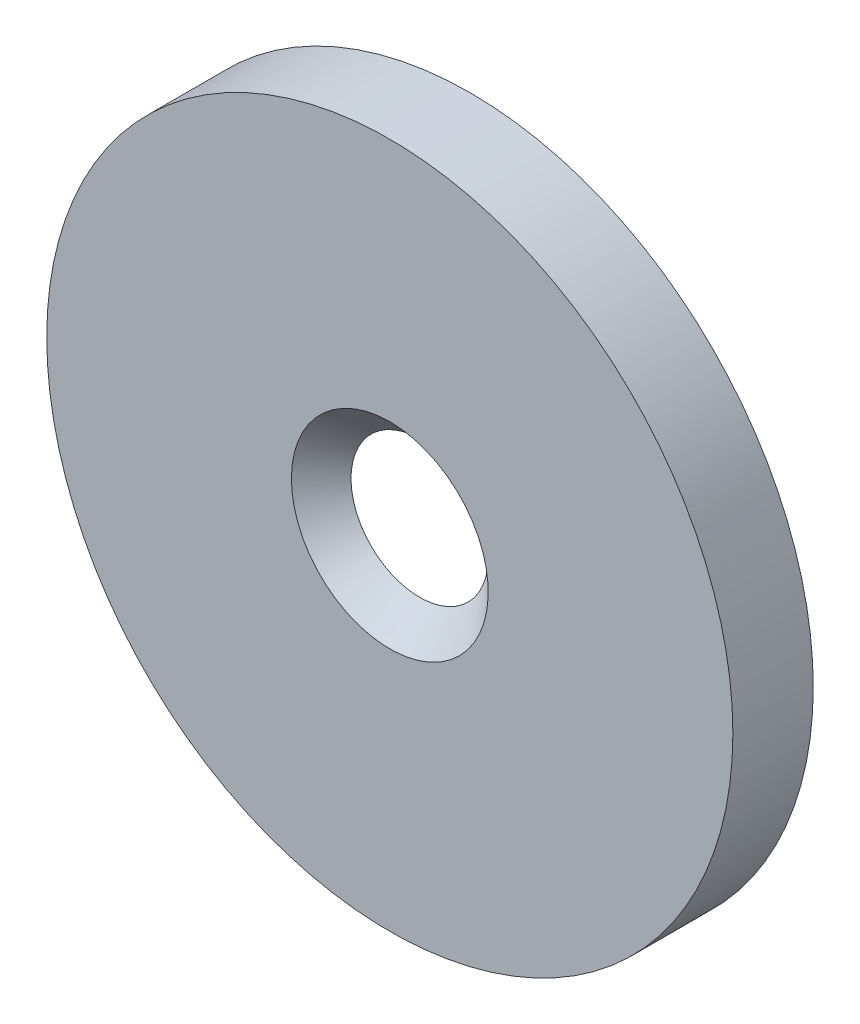
ISO-10303-21;
HEADER;
FILE_DESCRIPTION(('STEP AP214'),'2;1');
FILE_NAME('part.step','',(''),(''),'','','');
FILE_SCHEMA(('AUTOMOTIVE_DESIGN { 1 0 10303 214 1 1 1 1 }'));
ENDSEC;
DATA;
#1=APPLICATION_CONTEXT('core data for automotive mechanical design processes');
#2=APPLICATION_PROTOCOL_DEFINITION('international standard','automotive_design',2000,#1);
#3=PRODUCT_CONTEXT('',#1,'mechanical');
#4=PRODUCT('Part','Part','',(#3));
#5=PRODUCT_RELATED_PRODUCT_CATEGORY('part','',(#4));
#6=PRODUCT_DEFINITION_FORMATION('','',#4);
#7=PRODUCT_DEFINITION_CONTEXT('part definition',#1,'design');
#8=PRODUCT_DEFINITION('design','',#6,#7);
#9=PRODUCT_DEFINITION_SHAPE('','',#8);
#10=(LENGTH_UNIT() NAMED_UNIT(*) SI_UNIT(.MILLI.,.METRE.));
#11=(NAMED_UNIT(*) PLANE_ANGLE_UNIT() SI_UNIT($,.RADIAN.));
#12=(NAMED_UNIT(*) SI_UNIT($,.STERADIAN.) SOLID_ANGLE_UNIT());
#13=UNCERTAINTY_MEASURE_WITH_UNIT(LENGTH_MEASURE(1.E-05),#10,'distance_accuracy_value','');
#14=(GEOMETRIC_REPRESENTATION_CONTEXT(3) GLOBAL_UNCERTAINTY_ASSIGNED_CONTEXT((#13)) GLOBAL_UNIT_ASSIGNED_CONTEXT((#10,
#11,#12)) REPRESENTATION_CONTEXT('',''));
#15=CARTESIAN_POINT('',(0.,0.,0.));
#16=DIRECTION('',(0.,0.,1.));
#17=DIRECTION('',(1.,0.,0.));
#18=AXIS2_PLACEMENT_3D('',#15,#16,#17);
#19=CARTESIAN_POINT('',(0.,0.,-0.00199999999999853));
#20=DIRECTION('',(0.,0.,1.));
#21=DIRECTION('',(1.,0.,0.));
#22=AXIS2_PLACEMENT_3D('',#19,#20,#21);
#23=CYLINDRICAL_SURFACE('',#22,15.);
#24=CARTESIAN_POINT('',(0.,0.,20.0733));
#25=DIRECTION('',(0.,0.,1.));
#26=DIRECTION('',(1.,0.,0.));
#27=AXIS2_PLACEMENT_3D('',#24,#25,#26);
#28=CIRCLE('',#27,15.);
#29=CARTESIAN_POINT('',(15.,0.,20.0733));
#30=VERTEX_POINT('',#29);
#31=EDGE_CURVE('E10',#30,#30,#28,.T.);
#32=ORIENTED_EDGE('',*,*,#31,.F.);
#33=EDGE_LOOP('',(#32));
#34=FACE_BOUND('',#33,.T.);
#35=CARTESIAN_POINT('',(0.,0.,16.5588898069488));
#36=DIRECTION('',(0.,0.,1.));
#37=DIRECTION('',(1.,0.,0.));
#38=AXIS2_PLACEMENT_3D('',#35,#36,#37);
#39=CIRCLE('',#38,15.);
#40=CARTESIAN_POINT('',(0.,15.,16.5588898069488));
#41=VERTEX_POINT('',#40);
#42=EDGE_CURVE('E41',#41,#41,#39,.T.);
#43=ORIENTED_EDGE('',*,*,#42,.T.);
#44=EDGE_LOOP('',(#43));
#45=FACE_BOUND('',#44,.T.);
#46=ADVANCED_FACE('F35',(#34,#45),#23,.T.);
#47=CARTESIAN_POINT('',(0.,0.,20.0733));
#48=DIRECTION('',(0.,0.,1.));
#49=DIRECTION('',(1.,0.,0.));
#50=AXIS2_PLACEMENT_3D('',#47,#48,#49);
#51=PLANE('',#50);
#52=CARTESIAN_POINT('',(0.,0.,20.0733));
#53=DIRECTION('',(0.,0.,-1.));
#54=DIRECTION('',(-1.,0.,0.));
#55=AXIS2_PLACEMENT_3D('',#52,#53,#54);
#56=CIRCLE('',#55,4.30330900900983);
#57=CARTESIAN_POINT('',(-4.30330900900983,0.,20.0733));
#58=VERTEX_POINT('',#57);
#59=EDGE_CURVE('E53',#58,#58,#56,.T.);
#60=ORIENTED_EDGE('',*,*,#59,.T.);
#61=EDGE_LOOP('',(#60));
#62=FACE_BOUND('',#61,.T.);
#63=ORIENTED_EDGE('',*,*,#31,.T.);
#64=EDGE_LOOP('',(#63));
#65=FACE_BOUND('',#64,.T.);
#66=ADVANCED_FACE('F59',(#62,#65),#51,.T.);
#67=CARTESIAN_POINT('',(0.,0.,-31.18));
#68=DIRECTION('',(0.,0.,1.));
#69=DIRECTION('',(0.,1.,0.));
#70=AXIS2_PLACEMENT_3D('',#67,#68,#69);
#71=SPHERICAL_SURFACE('',#70,50.04);
#72=CARTESIAN_POINT('',(0.,0.,18.7699909909902));
#73=DIRECTION('',(0.,0.,-1.));
#74=DIRECTION('',(-1.,0.,0.));
#75=AXIS2_PLACEMENT_3D('',#72,#73,#74);
#76=CIRCLE('',#75,3.);
#77=CARTESIAN_POINT('',(0.,2.99999999999988,18.7699909909902));
#78=VERTEX_POINT('',#77);
#79=EDGE_CURVE('E46',#78,#78,#76,.T.);
#80=CARTESIAN_POINT('',(0.,2.99999999999988,18.7699909909902));
#81=CARTESIAN_POINT('',(0.,3.12719206790899,18.7623518365923));
#82=CARTESIAN_POINT('',(0.,3.2543549560647,18.7542268416389));
#83=CARTESIAN_POINT('',(0.,3.50861495510901,18.7370056894649));
#84=CARTESIAN_POINT('',(0.,3.63571206599762,18.7279095322442));
#85=CARTESIAN_POINT('',(0.,3.88983309274744,18.7087465743794));
#86=CARTESIAN_POINT('',(0.,4.01685700860866,18.6986797737353));
#87=CARTESIAN_POINT('',(0.,4.27082423284337,18.6775761196964));
#88=CARTESIAN_POINT('',(0.,4.39776754121686,18.6665392663017));
#89=CARTESIAN_POINT('',(0.,4.65156614244413,18.6434961499745));
#90=CARTESIAN_POINT('',(0.,4.77842143529792,18.6314898870421));
#91=CARTESIAN_POINT('',(0.,5.03203660266396,18.6065086525139));
#92=CARTESIAN_POINT('',(0.,5.15879647717621,18.5935336809182));
#93=CARTESIAN_POINT('',(0.,5.41221341058583,18.5666157861764));
#94=CARTESIAN_POINT('',(0.,5.53887046948321,18.5526728630303));
#95=CARTESIAN_POINT('',(0.,5.79207438039501,18.5238198788651));
#96=CARTESIAN_POINT('',(0.,5.91862123240943,18.5089098178461));
#97=CARTESIAN_POINT('',(0.,6.17159734471714,18.4781234280305));
#98=CARTESIAN_POINT('',(0.,6.29802660501042,18.4622470992338));
#99=CARTESIAN_POINT('',(0.,6.55076015590026,18.4295291003519));
#100=CARTESIAN_POINT('',(0.,6.67706444649682,18.4126874302666));
#101=CARTESIAN_POINT('',(0.,6.92954068731034,18.3780397316289));
#102=CARTESIAN_POINT('',(0.,7.0557126375273,18.3602337030765));
#103=CARTESIAN_POINT('',(0.,7.30791683462172,18.323658326603));
#104=CARTESIAN_POINT('',(0.,7.43394908149917,18.3048889786819));
#105=CARTESIAN_POINT('',(0.,7.68586651710724,18.2663880587855));
#106=CARTESIAN_POINT('',(0.,7.81175170583786,18.2466564868102));
#107=CARTESIAN_POINT('',(0.,8.06336767892676,18.2062322702718));
#108=CARTESIAN_POINT('',(0.,8.18909846328504,18.1855396257088));
#109=CARTESIAN_POINT('',(0.,8.44039829041425,18.1431944715463));
#110=CARTESIAN_POINT('',(0.,8.56596733318518,18.1215419619468));
#111=CARTESIAN_POINT('',(0.,8.81693634936337,18.0772783412774));
#112=CARTESIAN_POINT('',(0.,8.94233632277063,18.0546672302074));
#113=CARTESIAN_POINT('',(0.,9.19295988231146,18.0084877261033));
#114=CARTESIAN_POINT('',(0.,9.31818346844503,17.9849193330692));
#115=CARTESIAN_POINT('',(0.,9.56844694582181,17.936826640407));
#116=CARTESIAN_POINT('',(0.,9.69348683706502,17.9123023407789));
#117=CARTESIAN_POINT('',(0.,9.94337562776422,17.8622992660824));
#118=CARTESIAN_POINT('',(0.,10.0682245272202,17.8368204910139));
#119=CARTESIAN_POINT('',(0.,10.3177240485937,17.78490995229));
#120=CARTESIAN_POINT('',(0.,10.4423746705112,17.7584781886346));
#121=CARTESIAN_POINT('',(0.,10.6914703626274,17.7046632152034));
#122=CARTESIAN_POINT('',(0.,10.815915432826,17.6772800054276));
#123=CARTESIAN_POINT('',(0.,11.0645927593191,17.6215637377454));
#124=CARTESIAN_POINT('',(0.,11.1888250156137,17.5932306798389));
#125=CARTESIAN_POINT('',(0.,11.4370694645326,17.5356163693148));
#126=CARTESIAN_POINT('',(0.,11.5610816571569,17.5063351166972));
#127=CARTESIAN_POINT('',(0.,11.8088787418117,17.446826125504));
#128=CARTESIAN_POINT('',(0.,11.932663633842,17.4165983869284));
#129=CARTESIAN_POINT('',(0.,12.179998893649,17.3551981878047));
#130=CARTESIAN_POINT('',(0.,12.3035492614256,17.3240257272566));
#131=CARTESIAN_POINT('',(0.,12.5504082627529,17.2607379033095));
#132=CARTESIAN_POINT('',(0.,12.6737168963036,17.2286225399105));
#133=CARTESIAN_POINT('',(0.,12.9200852333076,17.1634507843874));
#134=CARTESIAN_POINT('',(0.,13.0431449367609,17.1303943922634));
#135=CARTESIAN_POINT('',(0.,13.2890082322483,17.0633425084067));
#136=CARTESIAN_POINT('',(0.,13.4118118242824,17.029347016674));
#137=CARTESIAN_POINT('',(0.,13.6571557304696,16.9604189172388));
#138=CARTESIAN_POINT('',(0.,13.7796960446228,16.9254863095362));
#139=CARTESIAN_POINT('',(0.,14.0245062442701,16.8546860175318));
#140=CARTESIAN_POINT('',(0.,14.1467761297643,16.81881833323));
#141=CARTESIAN_POINT('',(0.,14.391038335904,16.7461499780658));
#142=CARTESIAN_POINT('',(0.,14.5130306565496,16.7093493072033));
#143=CARTESIAN_POINT('',(0.,14.7567306174517,16.6348171379572));
#144=CARTESIAN_POINT('',(0.,14.8784382577082,16.5970856395734));
#145=CARTESIAN_POINT('',(0.,15.,16.5588898069488));
#146=B_SPLINE_CURVE_WITH_KNOTS('',3,(#80,#81,#82,#83,#84,#85,#86,#87,#88,#89,#90,#91,#92,#93,
#94,#95,#96,#97,#98,#99,#100,#101,#102,#103,#104,#105,#106,#107,#108,#109,#110,#111,#112,#113,
#114,#115,#116,#117,#118,#119,#120,#121,#122,#123,#124,#125,#126,#127,#128,#129,#130,#131,#132,
#133,#134,#135,#136,#137,#138,#139,#140,#141,#142,#143,#144,#145),.UNSPECIFIED.,.F.,.F.,(4,2,2,
2,2,2,2,2,2,2,2,2,2,2,2,2,2,2,2,2,2,2,2,2,2,2,2,2,2,2,2,2,4),(0.,0.382262865812766,
0.764525731625532,1.1467885974383,1.52905146325106,1.91131432906383,2.2935771948766,
2.67584006068936,3.05810292650213,3.44036579231491,3.82262865812767,4.20489152394044,
4.5871543897532,4.96941725556597,5.35168012137874,5.73394298719151,6.11620585300427,
6.49846871881704,6.8807315846298,7.26299445044257,7.64525731625533,8.0275201820681,
8.40978304788087,8.79204591369363,9.17430877950641,9.55657164531916,9.93883451113194,
10.3210973769447,10.7033602427575,11.0856231085702,11.467885974383,11.8501488401958,
12.2324117060085),.UNSPECIFIED.);
#147=EDGE_CURVE('BSEAM64',#78,#41,#146,.T.);
#148=ORIENTED_EDGE('',*,*,#79,.F.);
#149=ORIENTED_EDGE('',*,*,#42,.F.);
#150=ORIENTED_EDGE('',*,*,#147,.T.);
#151=ORIENTED_EDGE('',*,*,#147,.F.);
#152=EDGE_LOOP('',(#148,#150,#149,#151));
#153=FACE_BOUND('',#152,.T.);
#154=ADVANCED_FACE('F64',(#153),#71,.F.);
#155=CARTESIAN_POINT('',(0.,0.,18.7699909909902));
#156=DIRECTION('',(0.,0.,1.));
#157=DIRECTION('',(1.,0.,0.));
#158=AXIS2_PLACEMENT_3D('',#155,#156,#157);
#159=CONICAL_SURFACE('',#158,3.,0.785398163397453);
#160=ORIENTED_EDGE('',*,*,#59,.F.);
#161=EDGE_LOOP('',(#160));
#162=FACE_BOUND('',#161,.T.);
#163=ORIENTED_EDGE('',*,*,#79,.T.);
#164=EDGE_LOOP('',(#163));
#165=FACE_BOUND('',#164,.T.);
#166=ADVANCED_FACE('F61',(#162,#165),#159,.F.);
#167=CLOSED_SHELL('',(#46,#66,#154,#166));
#168=MANIFOLD_SOLID_BREP('B2',#167);
#169=ADVANCED_BREP_SHAPE_REPRESENTATION('',(#18,#168),#14);
#170=SHAPE_DEFINITION_REPRESENTATION(#9,#169);
ENDSEC;
END-ISO-10303-21;
